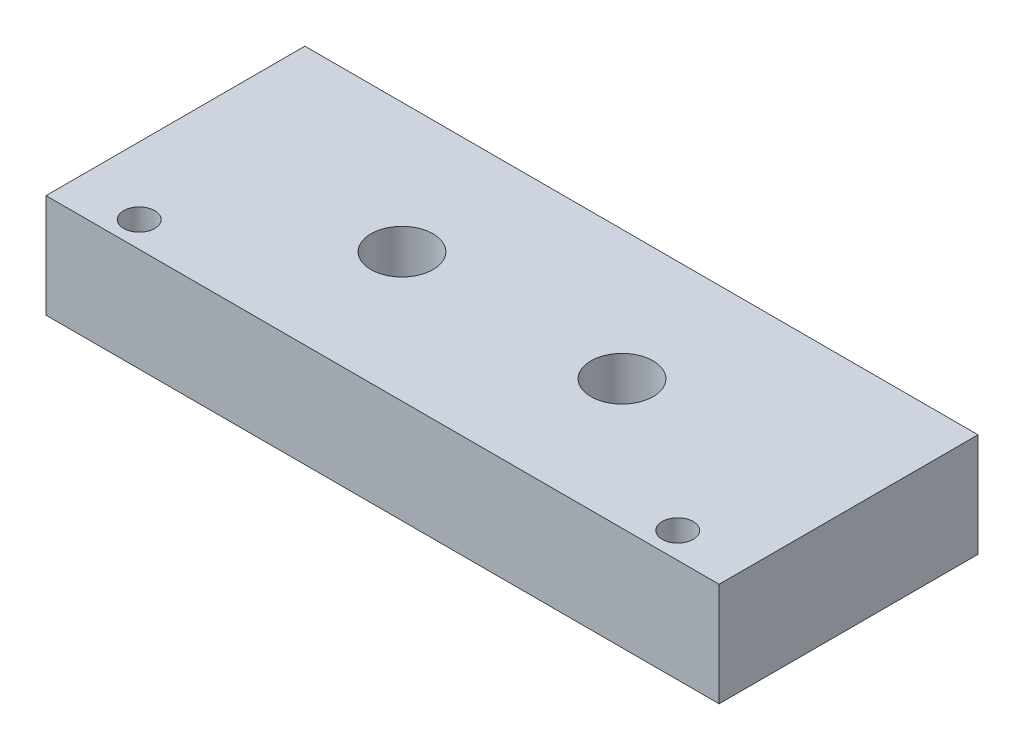
ISO-10303-21;
HEADER;
FILE_DESCRIPTION(('STEP AP214'),'2;1');
FILE_NAME('part.step','',(''),(''),'','','');
FILE_SCHEMA(('AUTOMOTIVE_DESIGN { 1 0 10303 214 1 1 1 1 }'));
ENDSEC;
DATA;
#1=APPLICATION_CONTEXT('core data for automotive mechanical design processes');
#2=APPLICATION_PROTOCOL_DEFINITION('international standard','automotive_design',2000,#1);
#3=PRODUCT_CONTEXT('',#1,'mechanical');
#4=PRODUCT('Part','Part','',(#3));
#5=PRODUCT_RELATED_PRODUCT_CATEGORY('part','',(#4));
#6=PRODUCT_DEFINITION_FORMATION('','',#4);
#7=PRODUCT_DEFINITION_CONTEXT('part definition',#1,'design');
#8=PRODUCT_DEFINITION('design','',#6,#7);
#9=PRODUCT_DEFINITION_SHAPE('','',#8);
#10=(LENGTH_UNIT() NAMED_UNIT(*) SI_UNIT(.MILLI.,.METRE.));
#11=(NAMED_UNIT(*) PLANE_ANGLE_UNIT() SI_UNIT($,.RADIAN.));
#12=(NAMED_UNIT(*) SI_UNIT($,.STERADIAN.) SOLID_ANGLE_UNIT());
#13=UNCERTAINTY_MEASURE_WITH_UNIT(LENGTH_MEASURE(1.E-05),#10,'distance_accuracy_value','');
#14=(GEOMETRIC_REPRESENTATION_CONTEXT(3) GLOBAL_UNCERTAINTY_ASSIGNED_CONTEXT((#13)) GLOBAL_UNIT_ASSIGNED_CONTEXT((#10,
#11,#12)) REPRESENTATION_CONTEXT('',''));
#15=CARTESIAN_POINT('',(0.,0.,0.));
#16=DIRECTION('',(0.,0.,1.));
#17=DIRECTION('',(1.,0.,0.));
#18=AXIS2_PLACEMENT_3D('',#15,#16,#17);
#19=CARTESIAN_POINT('',(0.,10.,0.));
#20=DIRECTION('',(0.,1.,0.));
#21=DIRECTION('',(0.,0.,1.));
#22=AXIS2_PLACEMENT_3D('',#19,#20,#21);
#23=PLANE('',#22);
#24=CARTESIAN_POINT('',(-26.,10.,9.99999999999999));
#25=DIRECTION('',(0.,-1.,0.));
#26=DIRECTION('',(0.,0.,-1.));
#27=AXIS2_PLACEMENT_3D('',#24,#25,#26);
#28=CIRCLE('',#27,1.5);
#29=CARTESIAN_POINT('',(-26.,10.,8.49999999999999));
#30=VERTEX_POINT('',#29);
#31=EDGE_CURVE('E133',#30,#30,#28,.T.);
#32=ORIENTED_EDGE('',*,*,#31,.T.);
#33=EDGE_LOOP('',(#32));
#34=FACE_BOUND('',#33,.T.);
#35=CARTESIAN_POINT('',(26.,10.,10.));
#36=DIRECTION('',(0.,-1.,0.));
#37=DIRECTION('',(0.,0.,-1.));
#38=AXIS2_PLACEMENT_3D('',#35,#36,#37);
#39=CIRCLE('',#38,1.5);
#40=CARTESIAN_POINT('',(26.,10.,8.5));
#41=VERTEX_POINT('',#40);
#42=EDGE_CURVE('E136',#41,#41,#39,.T.);
#43=ORIENTED_EDGE('',*,*,#42,.T.);
#44=EDGE_LOOP('',(#43));
#45=FACE_BOUND('',#44,.T.);
#46=CARTESIAN_POINT('',(-10.625,10.,0.));
#47=DIRECTION('',(0.,1.,0.));
#48=DIRECTION('',(0.,0.,1.));
#49=AXIS2_PLACEMENT_3D('',#46,#47,#48);
#50=CIRCLE('',#49,3.);
#51=CARTESIAN_POINT('',(-10.625,10.,3.));
#52=VERTEX_POINT('',#51);
#53=EDGE_CURVE('E112',#52,#52,#50,.T.);
#54=ORIENTED_EDGE('',*,*,#53,.F.);
#55=EDGE_LOOP('',(#54));
#56=FACE_BOUND('',#55,.T.);
#57=DIRECTION('',(0.,0.,-1.));
#58=VECTOR('',#57,1.);
#59=CARTESIAN_POINT('',(32.5,10.,-12.5));
#60=LINE('',#59,#58);
#61=CARTESIAN_POINT('',(32.5,10.,12.5));
#62=VERTEX_POINT('',#61);
#63=CARTESIAN_POINT('',(32.5,10.,-12.5));
#64=VERTEX_POINT('',#63);
#65=EDGE_CURVE('E97',#62,#64,#60,.T.);
#66=ORIENTED_EDGE('',*,*,#65,.T.);
#67=DIRECTION('',(-1.,0.,0.));
#68=VECTOR('',#67,1.);
#69=CARTESIAN_POINT('',(-32.5,10.,-12.5));
#70=LINE('',#69,#68);
#71=CARTESIAN_POINT('',(-32.5,10.,-12.5));
#72=VERTEX_POINT('',#71);
#73=EDGE_CURVE('E92',#64,#72,#70,.T.);
#74=ORIENTED_EDGE('',*,*,#73,.T.);
#75=DIRECTION('',(0.,0.,1.));
#76=VECTOR('',#75,1.);
#77=CARTESIAN_POINT('',(-32.5,10.,-12.5));
#78=LINE('',#77,#76);
#79=CARTESIAN_POINT('',(-32.5,10.,12.5));
#80=VERTEX_POINT('',#79);
#81=EDGE_CURVE('E95',#72,#80,#78,.T.);
#82=ORIENTED_EDGE('',*,*,#81,.T.);
#83=DIRECTION('',(1.,0.,0.));
#84=VECTOR('',#83,1.);
#85=CARTESIAN_POINT('',(-32.5,10.,12.5));
#86=LINE('',#85,#84);
#87=EDGE_CURVE('E62',#80,#62,#86,.T.);
#88=ORIENTED_EDGE('',*,*,#87,.T.);
#89=EDGE_LOOP('',(#66,#74,#82,#88));
#90=FACE_BOUND('',#89,.T.);
#91=CARTESIAN_POINT('',(10.625,10.,0.));
#92=DIRECTION('',(0.,1.,0.));
#93=DIRECTION('',(0.,0.,1.));
#94=AXIS2_PLACEMENT_3D('',#91,#92,#93);
#95=CIRCLE('',#94,3.);
#96=CARTESIAN_POINT('',(10.625,10.,3.));
#97=VERTEX_POINT('',#96);
#98=EDGE_CURVE('E127',#97,#97,#95,.T.);
#99=ORIENTED_EDGE('',*,*,#98,.F.);
#100=EDGE_LOOP('',(#99));
#101=FACE_BOUND('',#100,.T.);
#102=ADVANCED_FACE('F45',(#34,#45,#56,#90,#101),#23,.T.);
#103=CARTESIAN_POINT('',(0.,0.,0.));
#104=DIRECTION('',(0.,1.,0.));
#105=DIRECTION('',(0.,0.,1.));
#106=AXIS2_PLACEMENT_3D('',#103,#104,#105);
#107=PLANE('',#106);
#108=CARTESIAN_POINT('',(-26.,0.,9.99999999999999));
#109=DIRECTION('',(0.,-1.,0.));
#110=DIRECTION('',(0.,0.,-1.));
#111=AXIS2_PLACEMENT_3D('',#108,#109,#110);
#112=CIRCLE('',#111,1.5);
#113=CARTESIAN_POINT('',(-26.,0.,8.49999999999999));
#114=VERTEX_POINT('',#113);
#115=EDGE_CURVE('E142',#114,#114,#112,.T.);
#116=ORIENTED_EDGE('',*,*,#115,.F.);
#117=EDGE_LOOP('',(#116));
#118=FACE_BOUND('',#117,.T.);
#119=CARTESIAN_POINT('',(26.,0.,10.));
#120=DIRECTION('',(0.,-1.,0.));
#121=DIRECTION('',(0.,0.,-1.));
#122=AXIS2_PLACEMENT_3D('',#119,#120,#121);
#123=CIRCLE('',#122,1.5);
#124=CARTESIAN_POINT('',(26.,0.,8.5));
#125=VERTEX_POINT('',#124);
#126=EDGE_CURVE('E139',#125,#125,#123,.T.);
#127=ORIENTED_EDGE('',*,*,#126,.F.);
#128=EDGE_LOOP('',(#127));
#129=FACE_BOUND('',#128,.T.);
#130=DIRECTION('',(0.,0.,-1.));
#131=VECTOR('',#130,1.);
#132=CARTESIAN_POINT('',(32.5,0.,-12.5));
#133=LINE('',#132,#131);
#134=CARTESIAN_POINT('',(32.5,0.,12.5));
#135=VERTEX_POINT('',#134);
#136=CARTESIAN_POINT('',(32.5,0.,-12.5));
#137=VERTEX_POINT('',#136);
#138=EDGE_CURVE('E109',#135,#137,#133,.T.);
#139=ORIENTED_EDGE('',*,*,#138,.F.);
#140=DIRECTION('',(1.,0.,0.));
#141=VECTOR('',#140,1.);
#142=CARTESIAN_POINT('',(-32.5,0.,12.5));
#143=LINE('',#142,#141);
#144=CARTESIAN_POINT('',(-32.5,0.,12.5));
#145=VERTEX_POINT('',#144);
#146=EDGE_CURVE('E85',#145,#135,#143,.T.);
#147=ORIENTED_EDGE('',*,*,#146,.F.);
#148=DIRECTION('',(0.,0.,1.));
#149=VECTOR('',#148,1.);
#150=CARTESIAN_POINT('',(-32.5,0.,-12.5));
#151=LINE('',#150,#149);
#152=CARTESIAN_POINT('',(-32.5,0.,-12.5));
#153=VERTEX_POINT('',#152);
#154=EDGE_CURVE('E79',#153,#145,#151,.T.);
#155=ORIENTED_EDGE('',*,*,#154,.F.);
#156=DIRECTION('',(-1.,0.,0.));
#157=VECTOR('',#156,1.);
#158=CARTESIAN_POINT('',(-32.5,0.,-12.5));
#159=LINE('',#158,#157);
#160=EDGE_CURVE('E101',#137,#153,#159,.T.);
#161=ORIENTED_EDGE('',*,*,#160,.F.);
#162=EDGE_LOOP('',(#139,#147,#155,#161));
#163=FACE_BOUND('',#162,.T.);
#164=CARTESIAN_POINT('',(-10.625,0.,0.));
#165=DIRECTION('',(0.,1.,0.));
#166=DIRECTION('',(0.,0.,1.));
#167=AXIS2_PLACEMENT_3D('',#164,#165,#166);
#168=CIRCLE('',#167,3.);
#169=CARTESIAN_POINT('',(-10.625,0.,3.));
#170=VERTEX_POINT('',#169);
#171=EDGE_CURVE('E124',#170,#170,#168,.T.);
#172=ORIENTED_EDGE('',*,*,#171,.T.);
#173=EDGE_LOOP('',(#172));
#174=FACE_BOUND('',#173,.T.);
#175=CARTESIAN_POINT('',(10.625,0.,0.));
#176=DIRECTION('',(0.,1.,0.));
#177=DIRECTION('',(0.,0.,1.));
#178=AXIS2_PLACEMENT_3D('',#175,#176,#177);
#179=CIRCLE('',#178,3.);
#180=CARTESIAN_POINT('',(10.625,0.,3.));
#181=VERTEX_POINT('',#180);
#182=EDGE_CURVE('E130',#181,#181,#179,.T.);
#183=ORIENTED_EDGE('',*,*,#182,.T.);
#184=EDGE_LOOP('',(#183));
#185=FACE_BOUND('',#184,.T.);
#186=ADVANCED_FACE('F120',(#118,#129,#163,#174,#185),#107,.F.);
#187=CARTESIAN_POINT('',(32.5,10.,-12.5));
#188=DIRECTION('',(-1.,0.,0.));
#189=DIRECTION('',(0.,0.,1.));
#190=AXIS2_PLACEMENT_3D('',#187,#188,#189);
#191=PLANE('',#190);
#192=ORIENTED_EDGE('',*,*,#138,.T.);
#193=DIRECTION('',(0.,-1.,0.));
#194=VECTOR('',#193,1.);
#195=CARTESIAN_POINT('',(32.5,10.,-12.5));
#196=LINE('',#195,#194);
#197=EDGE_CURVE('E11',#64,#137,#196,.T.);
#198=ORIENTED_EDGE('',*,*,#197,.F.);
#199=ORIENTED_EDGE('',*,*,#65,.F.);
#200=DIRECTION('',(0.,-1.,0.));
#201=VECTOR('',#200,1.);
#202=CARTESIAN_POINT('',(32.5,10.,12.5));
#203=LINE('',#202,#201);
#204=EDGE_CURVE('E105',#62,#135,#203,.T.);
#205=ORIENTED_EDGE('',*,*,#204,.T.);
#206=EDGE_LOOP('',(#192,#198,#199,#205));
#207=FACE_BOUND('',#206,.T.);
#208=ADVANCED_FACE('F47',(#207),#191,.F.);
#209=CARTESIAN_POINT('',(-32.5,10.,-12.5));
#210=DIRECTION('',(0.,0.,1.));
#211=DIRECTION('',(1.,0.,0.));
#212=AXIS2_PLACEMENT_3D('',#209,#210,#211);
#213=PLANE('',#212);
#214=ORIENTED_EDGE('',*,*,#160,.T.);
#215=DIRECTION('',(0.,-1.,0.));
#216=VECTOR('',#215,1.);
#217=CARTESIAN_POINT('',(-32.5,10.,-12.5));
#218=LINE('',#217,#216);
#219=EDGE_CURVE('E54',#72,#153,#218,.T.);
#220=ORIENTED_EDGE('',*,*,#219,.F.);
#221=ORIENTED_EDGE('',*,*,#73,.F.);
#222=ORIENTED_EDGE('',*,*,#197,.T.);
#223=EDGE_LOOP('',(#214,#220,#221,#222));
#224=FACE_BOUND('',#223,.T.);
#225=ADVANCED_FACE('F100',(#224),#213,.F.);
#226=CARTESIAN_POINT('',(-32.5,10.,-12.5));
#227=DIRECTION('',(1.,0.,0.));
#228=DIRECTION('',(0.,0.,-1.));
#229=AXIS2_PLACEMENT_3D('',#226,#227,#228);
#230=PLANE('',#229);
#231=ORIENTED_EDGE('',*,*,#154,.T.);
#232=DIRECTION('',(0.,-1.,0.));
#233=VECTOR('',#232,1.);
#234=CARTESIAN_POINT('',(-32.5,10.,12.5));
#235=LINE('',#234,#233);
#236=EDGE_CURVE('E102',#80,#145,#235,.T.);
#237=ORIENTED_EDGE('',*,*,#236,.F.);
#238=ORIENTED_EDGE('',*,*,#81,.F.);
#239=ORIENTED_EDGE('',*,*,#219,.T.);
#240=EDGE_LOOP('',(#231,#237,#238,#239));
#241=FACE_BOUND('',#240,.T.);
#242=ADVANCED_FACE('F103',(#241),#230,.F.);
#243=CARTESIAN_POINT('',(-32.5,10.,12.5));
#244=DIRECTION('',(0.,0.,-1.));
#245=DIRECTION('',(-1.,0.,0.));
#246=AXIS2_PLACEMENT_3D('',#243,#244,#245);
#247=PLANE('',#246);
#248=ORIENTED_EDGE('',*,*,#146,.T.);
#249=ORIENTED_EDGE('',*,*,#204,.F.);
#250=ORIENTED_EDGE('',*,*,#87,.F.);
#251=ORIENTED_EDGE('',*,*,#236,.T.);
#252=EDGE_LOOP('',(#248,#249,#250,#251));
#253=FACE_BOUND('',#252,.T.);
#254=ADVANCED_FACE('F117',(#253),#247,.F.);
#255=CARTESIAN_POINT('',(-10.625,10.,0.));
#256=DIRECTION('',(0.,-1.,0.));
#257=DIRECTION('',(0.,0.,-1.));
#258=AXIS2_PLACEMENT_3D('',#255,#256,#257);
#259=CYLINDRICAL_SURFACE('',#258,3.);
#260=ORIENTED_EDGE('',*,*,#53,.T.);
#261=EDGE_LOOP('',(#260));
#262=FACE_BOUND('',#261,.T.);
#263=ORIENTED_EDGE('',*,*,#171,.F.);
#264=EDGE_LOOP('',(#263));
#265=FACE_BOUND('',#264,.T.);
#266=ADVANCED_FACE('F169',(#262,#265),#259,.F.);
#267=CARTESIAN_POINT('',(10.625,10.,0.));
#268=DIRECTION('',(0.,-1.,0.));
#269=DIRECTION('',(0.,0.,-1.));
#270=AXIS2_PLACEMENT_3D('',#267,#268,#269);
#271=CYLINDRICAL_SURFACE('',#270,3.);
#272=ORIENTED_EDGE('',*,*,#98,.T.);
#273=EDGE_LOOP('',(#272));
#274=FACE_BOUND('',#273,.T.);
#275=ORIENTED_EDGE('',*,*,#182,.F.);
#276=EDGE_LOOP('',(#275));
#277=FACE_BOUND('',#276,.T.);
#278=ADVANCED_FACE('F163',(#274,#277),#271,.F.);
#279=CARTESIAN_POINT('',(26.,10.,10.));
#280=DIRECTION('',(0.,-1.,0.));
#281=DIRECTION('',(0.,0.,-1.));
#282=AXIS2_PLACEMENT_3D('',#279,#280,#281);
#283=CYLINDRICAL_SURFACE('',#282,1.5);
#284=ORIENTED_EDGE('',*,*,#42,.F.);
#285=EDGE_LOOP('',(#284));
#286=FACE_BOUND('',#285,.T.);
#287=ORIENTED_EDGE('',*,*,#126,.T.);
#288=EDGE_LOOP('',(#287));
#289=FACE_BOUND('',#288,.T.);
#290=ADVANCED_FACE('F153',(#286,#289),#283,.F.);
#291=CARTESIAN_POINT('',(-26.,10.,9.99999999999999));
#292=DIRECTION('',(0.,-1.,0.));
#293=DIRECTION('',(0.,0.,-1.));
#294=AXIS2_PLACEMENT_3D('',#291,#292,#293);
#295=CYLINDRICAL_SURFACE('',#294,1.5);
#296=ORIENTED_EDGE('',*,*,#31,.F.);
#297=EDGE_LOOP('',(#296));
#298=FACE_BOUND('',#297,.T.);
#299=ORIENTED_EDGE('',*,*,#115,.T.);
#300=EDGE_LOOP('',(#299));
#301=FACE_BOUND('',#300,.T.);
#302=ADVANCED_FACE('F150',(#298,#301),#295,.F.);
#303=CLOSED_SHELL('',(#102,#186,#208,#225,#242,#254,#266,#278,#290,#302));
#304=MANIFOLD_SOLID_BREP('B2',#303);
#305=ADVANCED_BREP_SHAPE_REPRESENTATION('',(#18,#304),#14);
#306=SHAPE_DEFINITION_REPRESENTATION(#9,#305);
ENDSEC;
END-ISO-10303-21;
